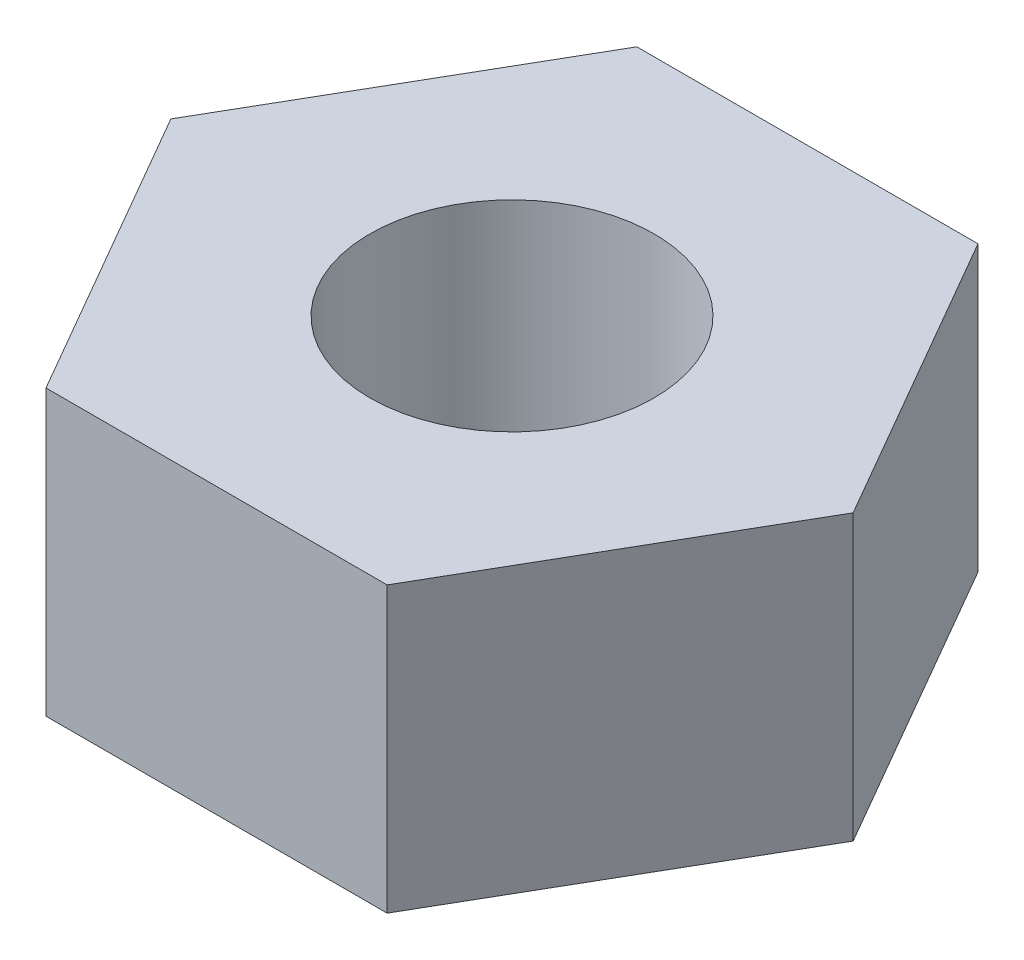
ISO-10303-21;
HEADER;
FILE_DESCRIPTION(('STEP AP214'),'2;1');
FILE_NAME('part.step','',(''),(''),'','','');
FILE_SCHEMA(('AUTOMOTIVE_DESIGN { 1 0 10303 214 1 1 1 1 }'));
ENDSEC;
DATA;
#1=APPLICATION_CONTEXT('core data for automotive mechanical design processes');
#2=APPLICATION_PROTOCOL_DEFINITION('international standard','automotive_design',2000,#1);
#3=PRODUCT_CONTEXT('',#1,'mechanical');
#4=PRODUCT('Part','Part','',(#3));
#5=PRODUCT_RELATED_PRODUCT_CATEGORY('part','',(#4));
#6=PRODUCT_DEFINITION_FORMATION('','',#4);
#7=PRODUCT_DEFINITION_CONTEXT('part definition',#1,'design');
#8=PRODUCT_DEFINITION('design','',#6,#7);
#9=PRODUCT_DEFINITION_SHAPE('','',#8);
#10=(LENGTH_UNIT() NAMED_UNIT(*) SI_UNIT(.MILLI.,.METRE.));
#11=(NAMED_UNIT(*) PLANE_ANGLE_UNIT() SI_UNIT($,.RADIAN.));
#12=(NAMED_UNIT(*) SI_UNIT($,.STERADIAN.) SOLID_ANGLE_UNIT());
#13=UNCERTAINTY_MEASURE_WITH_UNIT(LENGTH_MEASURE(1.E-05),#10,'distance_accuracy_value','');
#14=(GEOMETRIC_REPRESENTATION_CONTEXT(3) GLOBAL_UNCERTAINTY_ASSIGNED_CONTEXT((#13)) GLOBAL_UNIT_ASSIGNED_CONTEXT((#10,
#11,#12)) REPRESENTATION_CONTEXT('',''));
#15=CARTESIAN_POINT('',(0.,0.,0.));
#16=DIRECTION('',(0.,0.,1.));
#17=DIRECTION('',(1.,0.,0.));
#18=AXIS2_PLACEMENT_3D('',#15,#16,#17);
#19=CARTESIAN_POINT('',(12.,10.,0.));
#20=DIRECTION('',(-0.866025403784439,0.,0.5));
#21=DIRECTION('',(0.5,0.,0.866025403784439));
#22=AXIS2_PLACEMENT_3D('',#19,#20,#21);
#23=PLANE('',#22);
#24=DIRECTION('',(-0.5,0.,-0.866025403784439));
#25=VECTOR('',#24,1.);
#26=CARTESIAN_POINT('',(12.,0.,0.));
#27=LINE('',#26,#25);
#28=CARTESIAN_POINT('',(12.,0.,0.));
#29=VERTEX_POINT('',#28);
#30=CARTESIAN_POINT('',(6.,0.,-10.3923048454133));
#31=VERTEX_POINT('',#30);
#32=EDGE_CURVE('E134',#29,#31,#27,.T.);
#33=ORIENTED_EDGE('',*,*,#32,.T.);
#34=DIRECTION('',(0.,-1.,0.));
#35=VECTOR('',#34,1.);
#36=CARTESIAN_POINT('',(6.,10.,-10.3923048454133));
#37=LINE('',#36,#35);
#38=CARTESIAN_POINT('',(6.,10.,-10.3923048454133));
#39=VERTEX_POINT('',#38);
#40=EDGE_CURVE('E11',#39,#31,#37,.T.);
#41=ORIENTED_EDGE('',*,*,#40,.F.);
#42=DIRECTION('',(-0.5,0.,-0.866025403784439));
#43=VECTOR('',#42,1.);
#44=CARTESIAN_POINT('',(12.,10.,0.));
#45=LINE('',#44,#43);
#46=CARTESIAN_POINT('',(12.,10.,0.));
#47=VERTEX_POINT('',#46);
#48=EDGE_CURVE('E151',#47,#39,#45,.T.);
#49=ORIENTED_EDGE('',*,*,#48,.F.);
#50=DIRECTION('',(0.,-1.,0.));
#51=VECTOR('',#50,1.);
#52=CARTESIAN_POINT('',(12.,10.,0.));
#53=LINE('',#52,#51);
#54=EDGE_CURVE('E130',#47,#29,#53,.T.);
#55=ORIENTED_EDGE('',*,*,#54,.T.);
#56=EDGE_LOOP('',(#33,#41,#49,#55));
#57=FACE_BOUND('',#56,.T.);
#58=ADVANCED_FACE('F45',(#57),#23,.F.);
#59=CARTESIAN_POINT('',(6.,10.,-10.3923048454133));
#60=DIRECTION('',(0.,0.,1.));
#61=DIRECTION('',(1.,0.,0.));
#62=AXIS2_PLACEMENT_3D('',#59,#60,#61);
#63=PLANE('',#62);
#64=DIRECTION('',(-1.,0.,0.));
#65=VECTOR('',#64,1.);
#66=CARTESIAN_POINT('',(6.,0.,-10.3923048454133));
#67=LINE('',#66,#65);
#68=CARTESIAN_POINT('',(-6.,0.,-10.3923048454133));
#69=VERTEX_POINT('',#68);
#70=EDGE_CURVE('E138',#31,#69,#67,.T.);
#71=ORIENTED_EDGE('',*,*,#70,.T.);
#72=DIRECTION('',(0.,-1.,0.));
#73=VECTOR('',#72,1.);
#74=CARTESIAN_POINT('',(-6.,10.,-10.3923048454133));
#75=LINE('',#74,#73);
#76=CARTESIAN_POINT('',(-6.,10.,-10.3923048454133));
#77=VERTEX_POINT('',#76);
#78=EDGE_CURVE('E54',#77,#69,#75,.T.);
#79=ORIENTED_EDGE('',*,*,#78,.F.);
#80=DIRECTION('',(-1.,0.,0.));
#81=VECTOR('',#80,1.);
#82=CARTESIAN_POINT('',(6.,10.,-10.3923048454133));
#83=LINE('',#82,#81);
#84=EDGE_CURVE('E99',#39,#77,#83,.T.);
#85=ORIENTED_EDGE('',*,*,#84,.F.);
#86=ORIENTED_EDGE('',*,*,#40,.T.);
#87=EDGE_LOOP('',(#71,#79,#85,#86));
#88=FACE_BOUND('',#87,.T.);
#89=ADVANCED_FACE('F180',(#88),#63,.F.);
#90=CARTESIAN_POINT('',(-6.,10.,-10.3923048454133));
#91=DIRECTION('',(0.866025403784439,0.,0.5));
#92=DIRECTION('',(0.5,0.,-0.866025403784439));
#93=AXIS2_PLACEMENT_3D('',#90,#91,#92);
#94=PLANE('',#93);
#95=DIRECTION('',(-0.5,0.,0.866025403784439));
#96=VECTOR('',#95,1.);
#97=CARTESIAN_POINT('',(-6.,0.,-10.3923048454133));
#98=LINE('',#97,#96);
#99=CARTESIAN_POINT('',(-12.,0.,0.));
#100=VERTEX_POINT('',#99);
#101=EDGE_CURVE('E142',#69,#100,#98,.T.);
#102=ORIENTED_EDGE('',*,*,#101,.T.);
#103=DIRECTION('',(0.,-1.,0.));
#104=VECTOR('',#103,1.);
#105=CARTESIAN_POINT('',(-12.,10.,0.));
#106=LINE('',#105,#104);
#107=CARTESIAN_POINT('',(-12.,10.,0.));
#108=VERTEX_POINT('',#107);
#109=EDGE_CURVE('E123',#108,#100,#106,.T.);
#110=ORIENTED_EDGE('',*,*,#109,.F.);
#111=DIRECTION('',(-0.5,0.,0.866025403784439));
#112=VECTOR('',#111,1.);
#113=CARTESIAN_POINT('',(-6.,10.,-10.3923048454133));
#114=LINE('',#113,#112);
#115=EDGE_CURVE('E112',#77,#108,#114,.T.);
#116=ORIENTED_EDGE('',*,*,#115,.F.);
#117=ORIENTED_EDGE('',*,*,#78,.T.);
#118=EDGE_LOOP('',(#102,#110,#116,#117));
#119=FACE_BOUND('',#118,.T.);
#120=ADVANCED_FACE('F161',(#119),#94,.F.);
#121=CARTESIAN_POINT('',(-12.,10.,0.));
#122=DIRECTION('',(0.866025403784439,0.,-0.5));
#123=DIRECTION('',(-0.5,0.,-0.866025403784439));
#124=AXIS2_PLACEMENT_3D('',#121,#122,#123);
#125=PLANE('',#124);
#126=DIRECTION('',(0.5,0.,0.866025403784439));
#127=VECTOR('',#126,1.);
#128=CARTESIAN_POINT('',(-12.,0.,0.));
#129=LINE('',#128,#127);
#130=CARTESIAN_POINT('',(-6.,0.,10.3923048454133));
#131=VERTEX_POINT('',#130);
#132=EDGE_CURVE('E121',#100,#131,#129,.T.);
#133=ORIENTED_EDGE('',*,*,#132,.T.);
#134=DIRECTION('',(0.,-1.,0.));
#135=VECTOR('',#134,1.);
#136=CARTESIAN_POINT('',(-6.,10.,10.3923048454133));
#137=LINE('',#136,#135);
#138=CARTESIAN_POINT('',(-6.,10.,10.3923048454133));
#139=VERTEX_POINT('',#138);
#140=EDGE_CURVE('E118',#139,#131,#137,.T.);
#141=ORIENTED_EDGE('',*,*,#140,.F.);
#142=DIRECTION('',(0.5,0.,0.866025403784439));
#143=VECTOR('',#142,1.);
#144=CARTESIAN_POINT('',(-12.,10.,0.));
#145=LINE('',#144,#143);
#146=EDGE_CURVE('E106',#108,#139,#145,.T.);
#147=ORIENTED_EDGE('',*,*,#146,.F.);
#148=ORIENTED_EDGE('',*,*,#109,.T.);
#149=EDGE_LOOP('',(#133,#141,#147,#148));
#150=FACE_BOUND('',#149,.T.);
#151=ADVANCED_FACE('F119',(#150),#125,.F.);
#152=CARTESIAN_POINT('',(-6.,10.,10.3923048454133));
#153=DIRECTION('',(0.,0.,-1.));
#154=DIRECTION('',(-1.,0.,0.));
#155=AXIS2_PLACEMENT_3D('',#152,#153,#154);
#156=PLANE('',#155);
#157=DIRECTION('',(1.,0.,0.));
#158=VECTOR('',#157,1.);
#159=CARTESIAN_POINT('',(-6.,0.,10.3923048454133));
#160=LINE('',#159,#158);
#161=CARTESIAN_POINT('',(6.,0.,10.3923048454133));
#162=VERTEX_POINT('',#161);
#163=EDGE_CURVE('E85',#131,#162,#160,.T.);
#164=ORIENTED_EDGE('',*,*,#163,.T.);
#165=DIRECTION('',(0.,-1.,0.));
#166=VECTOR('',#165,1.);
#167=CARTESIAN_POINT('',(6.,10.,10.3923048454133));
#168=LINE('',#167,#166);
#169=CARTESIAN_POINT('',(6.,10.,10.3923048454133));
#170=VERTEX_POINT('',#169);
#171=EDGE_CURVE('E124',#170,#162,#168,.T.);
#172=ORIENTED_EDGE('',*,*,#171,.F.);
#173=DIRECTION('',(1.,0.,0.));
#174=VECTOR('',#173,1.);
#175=CARTESIAN_POINT('',(-6.,10.,10.3923048454133));
#176=LINE('',#175,#174);
#177=EDGE_CURVE('E110',#139,#170,#176,.T.);
#178=ORIENTED_EDGE('',*,*,#177,.F.);
#179=ORIENTED_EDGE('',*,*,#140,.T.);
#180=EDGE_LOOP('',(#164,#172,#178,#179));
#181=FACE_BOUND('',#180,.T.);
#182=ADVANCED_FACE('F126',(#181),#156,.F.);
#183=CARTESIAN_POINT('',(6.,10.,10.3923048454133));
#184=DIRECTION('',(-0.866025403784439,0.,-0.5));
#185=DIRECTION('',(-0.5,0.,0.866025403784439));
#186=AXIS2_PLACEMENT_3D('',#183,#184,#185);
#187=PLANE('',#186);
#188=DIRECTION('',(0.5,0.,-0.866025403784439));
#189=VECTOR('',#188,1.);
#190=CARTESIAN_POINT('',(6.,0.,10.3923048454133));
#191=LINE('',#190,#189);
#192=EDGE_CURVE('E91',#162,#29,#191,.T.);
#193=ORIENTED_EDGE('',*,*,#192,.T.);
#194=ORIENTED_EDGE('',*,*,#54,.F.);
#195=DIRECTION('',(0.5,0.,-0.866025403784439));
#196=VECTOR('',#195,1.);
#197=CARTESIAN_POINT('',(6.,10.,10.3923048454133));
#198=LINE('',#197,#196);
#199=EDGE_CURVE('E62',#170,#47,#198,.T.);
#200=ORIENTED_EDGE('',*,*,#199,.F.);
#201=ORIENTED_EDGE('',*,*,#171,.T.);
#202=EDGE_LOOP('',(#193,#194,#200,#201));
#203=FACE_BOUND('',#202,.T.);
#204=ADVANCED_FACE('F168',(#203),#187,.F.);
#205=CARTESIAN_POINT('',(0.,10.,0.));
#206=DIRECTION('',(0.,1.,0.));
#207=DIRECTION('',(0.,0.,1.));
#208=AXIS2_PLACEMENT_3D('',#205,#206,#207);
#209=PLANE('',#208);
#210=CARTESIAN_POINT('',(0.,10.,0.));
#211=DIRECTION('',(0.,1.,0.));
#212=DIRECTION('',(0.,0.,1.));
#213=AXIS2_PLACEMENT_3D('',#210,#211,#212);
#214=CIRCLE('',#213,5.);
#215=CARTESIAN_POINT('',(0.,10.,5.));
#216=VERTEX_POINT('',#215);
#217=EDGE_CURVE('E236',#216,#216,#214,.T.);
#218=ORIENTED_EDGE('',*,*,#217,.F.);
#219=EDGE_LOOP('',(#218));
#220=FACE_BOUND('',#219,.T.);
#221=ORIENTED_EDGE('',*,*,#48,.T.);
#222=ORIENTED_EDGE('',*,*,#84,.T.);
#223=ORIENTED_EDGE('',*,*,#115,.T.);
#224=ORIENTED_EDGE('',*,*,#146,.T.);
#225=ORIENTED_EDGE('',*,*,#177,.T.);
#226=ORIENTED_EDGE('',*,*,#199,.T.);
#227=EDGE_LOOP('',(#221,#222,#223,#224,#225,#226));
#228=FACE_BOUND('',#227,.T.);
#229=ADVANCED_FACE('F108',(#220,#228),#209,.T.);
#230=CARTESIAN_POINT('',(0.,0.,0.));
#231=DIRECTION('',(0.,1.,0.));
#232=DIRECTION('',(0.,0.,1.));
#233=AXIS2_PLACEMENT_3D('',#230,#231,#232);
#234=PLANE('',#233);
#235=CARTESIAN_POINT('',(0.,0.,0.));
#236=DIRECTION('',(0.,1.,0.));
#237=DIRECTION('',(0.,0.,1.));
#238=AXIS2_PLACEMENT_3D('',#235,#236,#237);
#239=CIRCLE('',#238,5.);
#240=CARTESIAN_POINT('',(0.,0.,5.));
#241=VERTEX_POINT('',#240);
#242=EDGE_CURVE('E139',#241,#241,#239,.T.);
#243=ORIENTED_EDGE('',*,*,#242,.T.);
#244=EDGE_LOOP('',(#243));
#245=FACE_BOUND('',#244,.T.);
#246=ORIENTED_EDGE('',*,*,#32,.F.);
#247=ORIENTED_EDGE('',*,*,#192,.F.);
#248=ORIENTED_EDGE('',*,*,#163,.F.);
#249=ORIENTED_EDGE('',*,*,#132,.F.);
#250=ORIENTED_EDGE('',*,*,#101,.F.);
#251=ORIENTED_EDGE('',*,*,#70,.F.);
#252=EDGE_LOOP('',(#246,#247,#248,#249,#250,#251));
#253=FACE_BOUND('',#252,.T.);
#254=ADVANCED_FACE('F164',(#245,#253),#234,.F.);
#255=CARTESIAN_POINT('',(0.,0.,0.));
#256=DIRECTION('',(0.,1.,0.));
#257=DIRECTION('',(0.,0.,1.));
#258=AXIS2_PLACEMENT_3D('',#255,#256,#257);
#259=CYLINDRICAL_SURFACE('',#258,5.);
#260=ORIENTED_EDGE('',*,*,#242,.F.);
#261=EDGE_LOOP('',(#260));
#262=FACE_BOUND('',#261,.T.);
#263=ORIENTED_EDGE('',*,*,#217,.T.);
#264=EDGE_LOOP('',(#263));
#265=FACE_BOUND('',#264,.T.);
#266=ADVANCED_FACE('F219',(#262,#265),#259,.F.);
#267=CLOSED_SHELL('',(#58,#89,#120,#151,#182,#204,#229,#254,#266));
#268=MANIFOLD_SOLID_BREP('B2',#267);
#269=ADVANCED_BREP_SHAPE_REPRESENTATION('',(#18,#268),#14);
#270=SHAPE_DEFINITION_REPRESENTATION(#9,#269);
ENDSEC;
END-ISO-10303-21;
